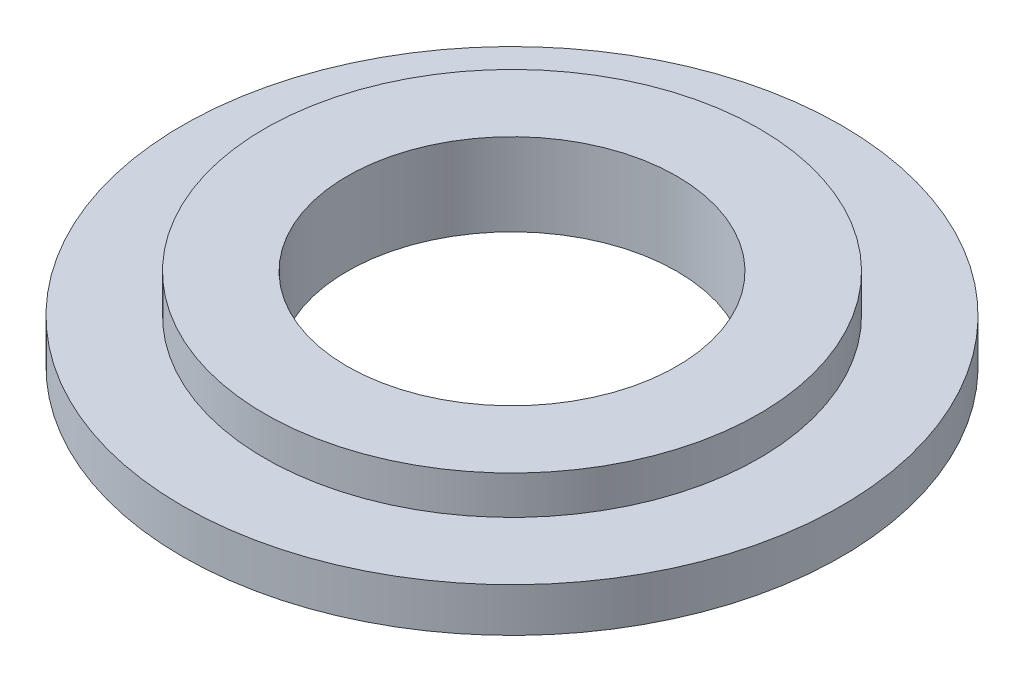
ISO-10303-21;
HEADER;
FILE_DESCRIPTION(('STEP AP214'),'2;1');
FILE_NAME('part.step','',(''),(''),'','','');
FILE_SCHEMA(('AUTOMOTIVE_DESIGN { 1 0 10303 214 1 1 1 1 }'));
ENDSEC;
DATA;
#1=APPLICATION_CONTEXT('core data for automotive mechanical design processes');
#2=APPLICATION_PROTOCOL_DEFINITION('international standard','automotive_design',2000,#1);
#3=PRODUCT_CONTEXT('',#1,'mechanical');
#4=PRODUCT('Part','Part','',(#3));
#5=PRODUCT_RELATED_PRODUCT_CATEGORY('part','',(#4));
#6=PRODUCT_DEFINITION_FORMATION('','',#4);
#7=PRODUCT_DEFINITION_CONTEXT('part definition',#1,'design');
#8=PRODUCT_DEFINITION('design','',#6,#7);
#9=PRODUCT_DEFINITION_SHAPE('','',#8);
#10=(LENGTH_UNIT() NAMED_UNIT(*) SI_UNIT(.MILLI.,.METRE.));
#11=(NAMED_UNIT(*) PLANE_ANGLE_UNIT() SI_UNIT($,.RADIAN.));
#12=(NAMED_UNIT(*) SI_UNIT($,.STERADIAN.) SOLID_ANGLE_UNIT());
#13=UNCERTAINTY_MEASURE_WITH_UNIT(LENGTH_MEASURE(1.E-05),#10,'distance_accuracy_value','');
#14=(GEOMETRIC_REPRESENTATION_CONTEXT(3) GLOBAL_UNCERTAINTY_ASSIGNED_CONTEXT((#13)) GLOBAL_UNIT_ASSIGNED_CONTEXT((#10,
#11,#12)) REPRESENTATION_CONTEXT('',''));
#15=CARTESIAN_POINT('',(0.,0.,0.));
#16=DIRECTION('',(0.,0.,1.));
#17=DIRECTION('',(1.,0.,0.));
#18=AXIS2_PLACEMENT_3D('',#15,#16,#17);
#19=CARTESIAN_POINT('',(0.,-1000.,-3.43024899888577E-12));
#20=DIRECTION('',(0.,-1.,0.));
#21=DIRECTION('',(0.,0.,-1.));
#22=AXIS2_PLACEMENT_3D('',#19,#20,#21);
#23=CYLINDRICAL_SURFACE('',#22,15.);
#24=CARTESIAN_POINT('',(0.,0.,0.));
#25=DIRECTION('',(0.,-1.,0.));
#26=DIRECTION('',(0.,0.,-1.));
#27=AXIS2_PLACEMENT_3D('',#24,#25,#26);
#28=CIRCLE('',#27,15.);
#29=CARTESIAN_POINT('',(0.,0.,-15.));
#30=VERTEX_POINT('',#29);
#31=EDGE_CURVE('E10',#30,#30,#28,.T.);
#32=ORIENTED_EDGE('',*,*,#31,.F.);
#33=EDGE_LOOP('',(#32));
#34=FACE_BOUND('',#33,.T.);
#35=CARTESIAN_POINT('',(0.,2.,0.));
#36=DIRECTION('',(0.,-1.,0.));
#37=DIRECTION('',(0.,0.,-1.));
#38=AXIS2_PLACEMENT_3D('',#35,#36,#37);
#39=CIRCLE('',#38,15.);
#40=CARTESIAN_POINT('',(0.,2.00000000000005,-15.));
#41=VERTEX_POINT('',#40);
#42=EDGE_CURVE('E56',#41,#41,#39,.T.);
#43=ORIENTED_EDGE('',*,*,#42,.T.);
#44=EDGE_LOOP('',(#43));
#45=FACE_BOUND('',#44,.T.);
#46=ADVANCED_FACE('F34',(#34,#45),#23,.T.);
#47=CARTESIAN_POINT('',(0.,0.,15.));
#48=DIRECTION('',(0.,1.,0.));
#49=DIRECTION('',(0.,0.,1.));
#50=AXIS2_PLACEMENT_3D('',#47,#48,#49);
#51=PLANE('',#50);
#52=CARTESIAN_POINT('',(0.,0.,0.));
#53=DIRECTION('',(0.,-1.,0.));
#54=DIRECTION('',(0.,0.,-1.));
#55=AXIS2_PLACEMENT_3D('',#52,#53,#54);
#56=CIRCLE('',#55,7.4999990242105);
#57=CARTESIAN_POINT('',(0.,0.,-7.4999990242105));
#58=VERTEX_POINT('',#57);
#59=EDGE_CURVE('E40',#58,#58,#56,.T.);
#60=ORIENTED_EDGE('',*,*,#59,.F.);
#61=EDGE_LOOP('',(#60));
#62=FACE_BOUND('',#61,.T.);
#63=ORIENTED_EDGE('',*,*,#31,.T.);
#64=EDGE_LOOP('',(#63));
#65=FACE_BOUND('',#64,.T.);
#66=ADVANCED_FACE('F81',(#62,#65),#51,.F.);
#67=CARTESIAN_POINT('',(0.,-1000.,-3.43024899888577E-12));
#68=DIRECTION('',(0.,-1.,0.));
#69=DIRECTION('',(0.,0.,-1.));
#70=AXIS2_PLACEMENT_3D('',#67,#68,#69);
#71=CYLINDRICAL_SURFACE('',#70,7.49999902421049);
#72=CARTESIAN_POINT('',(0.,3.74999999999992,0.));
#73=DIRECTION('',(0.,-1.,0.));
#74=DIRECTION('',(0.,0.,-1.));
#75=AXIS2_PLACEMENT_3D('',#72,#73,#74);
#76=CIRCLE('',#75,7.49999902421049);
#77=CARTESIAN_POINT('',(0.,3.74999999999995,-7.49999902421047));
#78=VERTEX_POINT('',#77);
#79=EDGE_CURVE('E44',#78,#78,#76,.T.);
#80=ORIENTED_EDGE('',*,*,#79,.F.);
#81=EDGE_LOOP('',(#80));
#82=FACE_BOUND('',#81,.T.);
#83=ORIENTED_EDGE('',*,*,#59,.T.);
#84=EDGE_LOOP('',(#83));
#85=FACE_BOUND('',#84,.T.);
#86=ADVANCED_FACE('F76',(#82,#85),#71,.F.);
#87=CARTESIAN_POINT('',(0.,3.74999999999999,11.25));
#88=DIRECTION('',(0.,-1.,0.));
#89=DIRECTION('',(0.,0.,-1.));
#90=AXIS2_PLACEMENT_3D('',#87,#88,#89);
#91=PLANE('',#90);
#92=CARTESIAN_POINT('',(0.,3.74999999999992,0.));
#93=DIRECTION('',(0.,-1.,0.));
#94=DIRECTION('',(0.,0.,-1.));
#95=AXIS2_PLACEMENT_3D('',#92,#93,#94);
#96=CIRCLE('',#95,11.25);
#97=CARTESIAN_POINT('',(0.,3.74999999999996,-11.25));
#98=VERTEX_POINT('',#97);
#99=EDGE_CURVE('E48',#98,#98,#96,.T.);
#100=ORIENTED_EDGE('',*,*,#99,.F.);
#101=EDGE_LOOP('',(#100));
#102=FACE_BOUND('',#101,.T.);
#103=ORIENTED_EDGE('',*,*,#79,.T.);
#104=EDGE_LOOP('',(#103));
#105=FACE_BOUND('',#104,.T.);
#106=ADVANCED_FACE('F70',(#102,#105),#91,.F.);
#107=CARTESIAN_POINT('',(0.,-1000.,-3.43024899888577E-12));
#108=DIRECTION('',(0.,-1.,0.));
#109=DIRECTION('',(0.,0.,-1.));
#110=AXIS2_PLACEMENT_3D('',#107,#108,#109);
#111=CYLINDRICAL_SURFACE('',#110,11.25);
#112=CARTESIAN_POINT('',(0.,2.,0.));
#113=DIRECTION('',(0.,-1.,0.));
#114=DIRECTION('',(0.,0.,-1.));
#115=AXIS2_PLACEMENT_3D('',#112,#113,#114);
#116=CIRCLE('',#115,11.25);
#117=CARTESIAN_POINT('',(0.,2.00000000000004,-11.25));
#118=VERTEX_POINT('',#117);
#119=EDGE_CURVE('E53',#118,#118,#116,.T.);
#120=ORIENTED_EDGE('',*,*,#119,.F.);
#121=EDGE_LOOP('',(#120));
#122=FACE_BOUND('',#121,.T.);
#123=ORIENTED_EDGE('',*,*,#99,.T.);
#124=EDGE_LOOP('',(#123));
#125=FACE_BOUND('',#124,.T.);
#126=ADVANCED_FACE('F64',(#122,#125),#111,.T.);
#127=CARTESIAN_POINT('',(0.,1.99999999999999,15.));
#128=DIRECTION('',(0.,-1.,0.));
#129=DIRECTION('',(0.,0.,-1.));
#130=AXIS2_PLACEMENT_3D('',#127,#128,#129);
#131=PLANE('',#130);
#132=ORIENTED_EDGE('',*,*,#42,.F.);
#133=EDGE_LOOP('',(#132));
#134=FACE_BOUND('',#133,.T.);
#135=ORIENTED_EDGE('',*,*,#119,.T.);
#136=EDGE_LOOP('',(#135));
#137=FACE_BOUND('',#136,.T.);
#138=ADVANCED_FACE('F61',(#134,#137),#131,.F.);
#139=CLOSED_SHELL('',(#46,#66,#86,#106,#126,#138));
#140=MANIFOLD_SOLID_BREP('B2',#139);
#141=ADVANCED_BREP_SHAPE_REPRESENTATION('',(#18,#140),#14);
#142=SHAPE_DEFINITION_REPRESENTATION(#9,#141);
ENDSEC;
END-ISO-10303-21;
